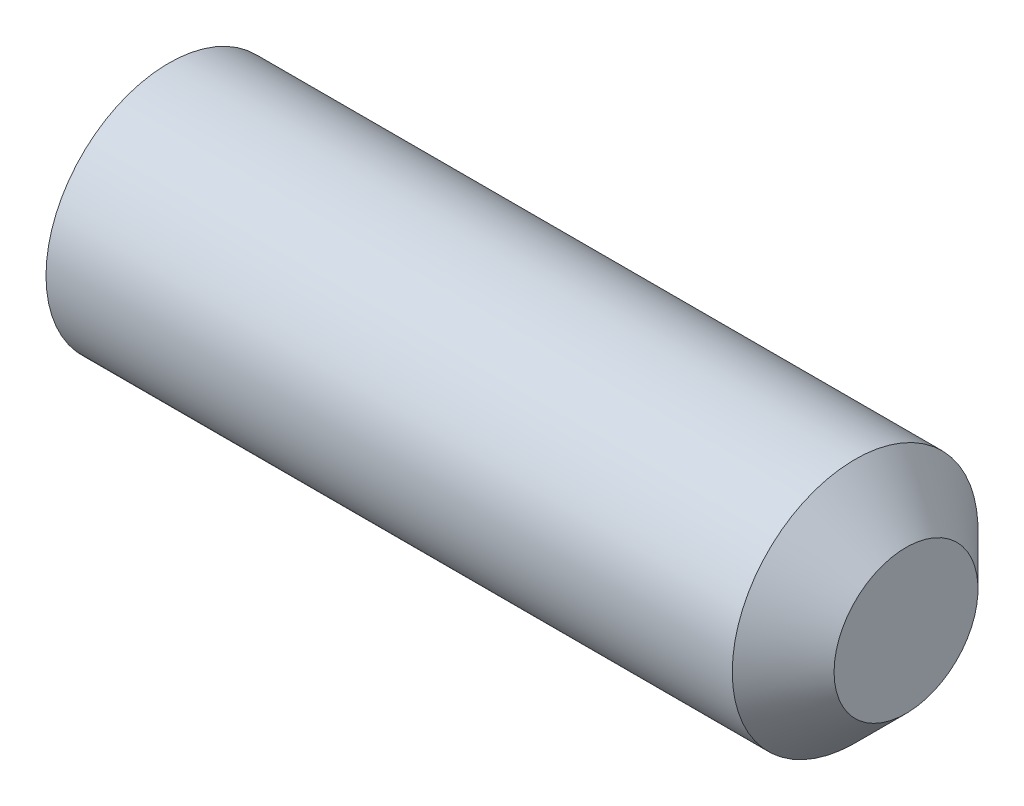
ISO-10303-21;
HEADER;
FILE_DESCRIPTION(('STEP AP214'),'2;1');
FILE_NAME('part.step','',(''),(''),'','','');
FILE_SCHEMA(('AUTOMOTIVE_DESIGN { 1 0 10303 214 1 1 1 1 }'));
ENDSEC;
DATA;
#1=APPLICATION_CONTEXT('core data for automotive mechanical design processes');
#2=APPLICATION_PROTOCOL_DEFINITION('international standard','automotive_design',2000,#1);
#3=PRODUCT_CONTEXT('',#1,'mechanical');
#4=PRODUCT('Part','Part','',(#3));
#5=PRODUCT_RELATED_PRODUCT_CATEGORY('part','',(#4));
#6=PRODUCT_DEFINITION_FORMATION('','',#4);
#7=PRODUCT_DEFINITION_CONTEXT('part definition',#1,'design');
#8=PRODUCT_DEFINITION('design','',#6,#7);
#9=PRODUCT_DEFINITION_SHAPE('','',#8);
#10=(LENGTH_UNIT() NAMED_UNIT(*) SI_UNIT(.MILLI.,.METRE.));
#11=(NAMED_UNIT(*) PLANE_ANGLE_UNIT() SI_UNIT($,.RADIAN.));
#12=(NAMED_UNIT(*) SI_UNIT($,.STERADIAN.) SOLID_ANGLE_UNIT());
#13=UNCERTAINTY_MEASURE_WITH_UNIT(LENGTH_MEASURE(1.E-05),#10,'distance_accuracy_value','');
#14=(GEOMETRIC_REPRESENTATION_CONTEXT(3) GLOBAL_UNCERTAINTY_ASSIGNED_CONTEXT((#13)) GLOBAL_UNIT_ASSIGNED_CONTEXT((#10,
#11,#12)) REPRESENTATION_CONTEXT('',''));
#15=CARTESIAN_POINT('',(0.,0.,0.));
#16=DIRECTION('',(0.,0.,1.));
#17=DIRECTION('',(1.,0.,0.));
#18=AXIS2_PLACEMENT_3D('',#15,#16,#17);
#19=CARTESIAN_POINT('',(0.,5.,0.));
#20=DIRECTION('',(1.,0.,0.));
#21=DIRECTION('',(0.,0.,-1.));
#22=AXIS2_PLACEMENT_3D('',#19,#20,#21);
#23=PLANE('',#22);
#24=DIRECTION('',(0.,-0.866025403784439,-0.5));
#25=VECTOR('',#24,1.);
#26=CARTESIAN_POINT('',(0.,2.5,-1.44337567297406));
#27=LINE('',#26,#25);
#28=CARTESIAN_POINT('',(0.,2.5,-1.44337567297406));
#29=VERTEX_POINT('',#28);
#30=CARTESIAN_POINT('',(0.,0.,-2.88675134594813));
#31=VERTEX_POINT('',#30);
#32=EDGE_CURVE('E122',#29,#31,#27,.T.);
#33=ORIENTED_EDGE('',*,*,#32,.F.);
#34=DIRECTION('',(0.,0.,-1.));
#35=VECTOR('',#34,1.);
#36=CARTESIAN_POINT('',(0.,2.5,1.44337567297407));
#37=LINE('',#36,#35);
#38=CARTESIAN_POINT('',(0.,2.5,1.44337567297407));
#39=VERTEX_POINT('',#38);
#40=EDGE_CURVE('E48',#39,#29,#37,.T.);
#41=ORIENTED_EDGE('',*,*,#40,.F.);
#42=DIRECTION('',(0.,0.866025403784439,-0.5));
#43=VECTOR('',#42,1.);
#44=CARTESIAN_POINT('',(0.,0.,2.88675134594813));
#45=LINE('',#44,#43);
#46=CARTESIAN_POINT('',(0.,0.,2.88675134594813));
#47=VERTEX_POINT('',#46);
#48=EDGE_CURVE('E131',#47,#39,#45,.T.);
#49=ORIENTED_EDGE('',*,*,#48,.F.);
#50=DIRECTION('',(0.,0.866025403784439,0.5));
#51=VECTOR('',#50,1.);
#52=CARTESIAN_POINT('',(0.,-2.5,1.44337567297406));
#53=LINE('',#52,#51);
#54=CARTESIAN_POINT('',(0.,-2.5,1.44337567297406));
#55=VERTEX_POINT('',#54);
#56=EDGE_CURVE('E129',#55,#47,#53,.T.);
#57=ORIENTED_EDGE('',*,*,#56,.F.);
#58=DIRECTION('',(0.,0.,1.));
#59=VECTOR('',#58,1.);
#60=CARTESIAN_POINT('',(0.,-2.5,-1.44337567297407));
#61=LINE('',#60,#59);
#62=CARTESIAN_POINT('',(0.,-2.5,-1.44337567297407));
#63=VERTEX_POINT('',#62);
#64=EDGE_CURVE('E96',#63,#55,#61,.T.);
#65=ORIENTED_EDGE('',*,*,#64,.F.);
#66=DIRECTION('',(0.,-0.866025403784439,0.5));
#67=VECTOR('',#66,1.);
#68=CARTESIAN_POINT('',(0.,0.,-2.88675134594813));
#69=LINE('',#68,#67);
#70=EDGE_CURVE('E125',#31,#63,#69,.T.);
#71=ORIENTED_EDGE('',*,*,#70,.F.);
#72=EDGE_LOOP('',(#33,#41,#49,#57,#65,#71));
#73=FACE_BOUND('',#72,.T.);
#74=CARTESIAN_POINT('',(0.,0.,0.));
#75=DIRECTION('',(-1.,0.,0.));
#76=DIRECTION('',(0.,0.,1.));
#77=AXIS2_PLACEMENT_3D('',#74,#75,#76);
#78=CIRCLE('',#77,5.);
#79=CARTESIAN_POINT('',(0.,0.,5.));
#80=VERTEX_POINT('',#79);
#81=EDGE_CURVE('E11',#80,#80,#78,.T.);
#82=ORIENTED_EDGE('',*,*,#81,.T.);
#83=EDGE_LOOP('',(#82));
#84=FACE_BOUND('',#83,.T.);
#85=ADVANCED_FACE('F34',(#73,#84),#23,.F.);
#86=CARTESIAN_POINT('',(0.,0.,0.));
#87=DIRECTION('',(-1.,0.,0.));
#88=DIRECTION('',(0.,0.,1.));
#89=AXIS2_PLACEMENT_3D('',#86,#87,#88);
#90=CYLINDRICAL_SURFACE('',#89,5.);
#91=ORIENTED_EDGE('',*,*,#81,.F.);
#92=EDGE_LOOP('',(#91));
#93=FACE_BOUND('',#92,.T.);
#94=CARTESIAN_POINT('',(27.9289321881345,0.,0.));
#95=DIRECTION('',(-1.,0.,0.));
#96=DIRECTION('',(0.,0.,1.));
#97=AXIS2_PLACEMENT_3D('',#94,#95,#96);
#98=CIRCLE('',#97,5.);
#99=CARTESIAN_POINT('',(27.9289321881345,0.,5.));
#100=VERTEX_POINT('',#99);
#101=EDGE_CURVE('E41',#100,#100,#98,.T.);
#102=ORIENTED_EDGE('',*,*,#101,.T.);
#103=EDGE_LOOP('',(#102));
#104=FACE_BOUND('',#103,.T.);
#105=ADVANCED_FACE('F145',(#93,#104),#90,.T.);
#106=CARTESIAN_POINT('',(30.,0.,0.));
#107=DIRECTION('',(-1.,0.,0.));
#108=DIRECTION('',(0.,0.,1.));
#109=AXIS2_PLACEMENT_3D('',#106,#107,#108);
#110=CONICAL_SURFACE('',#109,2.92893218813453,0.785398163397449);
#111=ORIENTED_EDGE('',*,*,#101,.F.);
#112=EDGE_LOOP('',(#111));
#113=FACE_BOUND('',#112,.T.);
#114=CARTESIAN_POINT('',(30.,0.,0.));
#115=DIRECTION('',(-1.,0.,0.));
#116=DIRECTION('',(0.,0.,1.));
#117=AXIS2_PLACEMENT_3D('',#114,#115,#116);
#118=CIRCLE('',#117,2.92893218813453);
#119=CARTESIAN_POINT('',(30.,0.,2.92893218813453));
#120=VERTEX_POINT('',#119);
#121=EDGE_CURVE('E135',#120,#120,#118,.T.);
#122=ORIENTED_EDGE('',*,*,#121,.T.);
#123=EDGE_LOOP('',(#122));
#124=FACE_BOUND('',#123,.T.);
#125=ADVANCED_FACE('F147',(#113,#124),#110,.T.);
#126=CARTESIAN_POINT('',(30.,2.92893218813453,0.));
#127=DIRECTION('',(-1.,0.,0.));
#128=DIRECTION('',(0.,0.,1.));
#129=AXIS2_PLACEMENT_3D('',#126,#127,#128);
#130=PLANE('',#129);
#131=ORIENTED_EDGE('',*,*,#121,.F.);
#132=EDGE_LOOP('',(#131));
#133=FACE_BOUND('',#132,.T.);
#134=ADVANCED_FACE('F150',(#133),#130,.F.);
#135=CARTESIAN_POINT('',(3.,2.5,1.44337567297407));
#136=DIRECTION('',(0.,1.,0.));
#137=DIRECTION('',(0.,0.,1.));
#138=AXIS2_PLACEMENT_3D('',#135,#136,#137);
#139=PLANE('',#138);
#140=ORIENTED_EDGE('',*,*,#40,.T.);
#141=DIRECTION('',(-1.,0.,0.));
#142=VECTOR('',#141,1.);
#143=CARTESIAN_POINT('',(3.,2.5,-1.44337567297406));
#144=LINE('',#143,#142);
#145=CARTESIAN_POINT('',(3.,2.5,-1.44337567297406));
#146=VERTEX_POINT('',#145);
#147=EDGE_CURVE('E78',#146,#29,#144,.T.);
#148=ORIENTED_EDGE('',*,*,#147,.F.);
#149=DIRECTION('',(0.,0.,-1.));
#150=VECTOR('',#149,1.);
#151=CARTESIAN_POINT('',(3.,2.5,1.44337567297407));
#152=LINE('',#151,#150);
#153=CARTESIAN_POINT('',(3.,2.5,1.44337567297407));
#154=VERTEX_POINT('',#153);
#155=EDGE_CURVE('E133',#154,#146,#152,.T.);
#156=ORIENTED_EDGE('',*,*,#155,.F.);
#157=DIRECTION('',(-1.,0.,0.));
#158=VECTOR('',#157,1.);
#159=CARTESIAN_POINT('',(3.,2.5,1.44337567297407));
#160=LINE('',#159,#158);
#161=EDGE_CURVE('E56',#154,#39,#160,.T.);
#162=ORIENTED_EDGE('',*,*,#161,.T.);
#163=EDGE_LOOP('',(#140,#148,#156,#162));
#164=FACE_BOUND('',#163,.T.);
#165=ADVANCED_FACE('F155',(#164),#139,.F.);
#166=CARTESIAN_POINT('',(3.,0.,2.88675134594813));
#167=DIRECTION('',(0.,0.5,0.866025403784439));
#168=DIRECTION('',(0.,-0.866025403784439,0.5));
#169=AXIS2_PLACEMENT_3D('',#166,#167,#168);
#170=PLANE('',#169);
#171=ORIENTED_EDGE('',*,*,#48,.T.);
#172=ORIENTED_EDGE('',*,*,#161,.F.);
#173=DIRECTION('',(0.,0.866025403784439,-0.5));
#174=VECTOR('',#173,1.);
#175=CARTESIAN_POINT('',(3.,0.,2.88675134594813));
#176=LINE('',#175,#174);
#177=CARTESIAN_POINT('',(3.,0.,2.88675134594813));
#178=VERTEX_POINT('',#177);
#179=EDGE_CURVE('E108',#178,#154,#176,.T.);
#180=ORIENTED_EDGE('',*,*,#179,.F.);
#181=DIRECTION('',(-1.,0.,0.));
#182=VECTOR('',#181,1.);
#183=CARTESIAN_POINT('',(3.,0.,2.88675134594813));
#184=LINE('',#183,#182);
#185=EDGE_CURVE('E100',#178,#47,#184,.T.);
#186=ORIENTED_EDGE('',*,*,#185,.T.);
#187=EDGE_LOOP('',(#171,#172,#180,#186));
#188=FACE_BOUND('',#187,.T.);
#189=ADVANCED_FACE('F160',(#188),#170,.F.);
#190=CARTESIAN_POINT('',(3.,-2.5,1.44337567297406));
#191=DIRECTION('',(0.,-0.5,0.866025403784438));
#192=DIRECTION('',(0.,-0.866025403784439,-0.5));
#193=AXIS2_PLACEMENT_3D('',#190,#191,#192);
#194=PLANE('',#193);
#195=ORIENTED_EDGE('',*,*,#56,.T.);
#196=ORIENTED_EDGE('',*,*,#185,.F.);
#197=DIRECTION('',(0.,0.866025403784439,0.5));
#198=VECTOR('',#197,1.);
#199=CARTESIAN_POINT('',(3.,-2.5,1.44337567297406));
#200=LINE('',#199,#198);
#201=CARTESIAN_POINT('',(3.,-2.5,1.44337567297406));
#202=VERTEX_POINT('',#201);
#203=EDGE_CURVE('E104',#202,#178,#200,.T.);
#204=ORIENTED_EDGE('',*,*,#203,.F.);
#205=DIRECTION('',(-1.,0.,0.));
#206=VECTOR('',#205,1.);
#207=CARTESIAN_POINT('',(3.,-2.5,1.44337567297406));
#208=LINE('',#207,#206);
#209=EDGE_CURVE('E89',#202,#55,#208,.T.);
#210=ORIENTED_EDGE('',*,*,#209,.T.);
#211=EDGE_LOOP('',(#195,#196,#204,#210));
#212=FACE_BOUND('',#211,.T.);
#213=ADVANCED_FACE('F105',(#212),#194,.F.);
#214=CARTESIAN_POINT('',(3.,-2.5,-1.44337567297407));
#215=DIRECTION('',(0.,-1.,0.));
#216=DIRECTION('',(0.,0.,-1.));
#217=AXIS2_PLACEMENT_3D('',#214,#215,#216);
#218=PLANE('',#217);
#219=ORIENTED_EDGE('',*,*,#64,.T.);
#220=ORIENTED_EDGE('',*,*,#209,.F.);
#221=DIRECTION('',(0.,0.,1.));
#222=VECTOR('',#221,1.);
#223=CARTESIAN_POINT('',(3.,-2.5,-1.44337567297407));
#224=LINE('',#223,#222);
#225=CARTESIAN_POINT('',(3.,-2.5,-1.44337567297407));
#226=VERTEX_POINT('',#225);
#227=EDGE_CURVE('E93',#226,#202,#224,.T.);
#228=ORIENTED_EDGE('',*,*,#227,.F.);
#229=DIRECTION('',(-1.,0.,0.));
#230=VECTOR('',#229,1.);
#231=CARTESIAN_POINT('',(3.,-2.5,-1.44337567297407));
#232=LINE('',#231,#230);
#233=EDGE_CURVE('E101',#226,#63,#232,.T.);
#234=ORIENTED_EDGE('',*,*,#233,.T.);
#235=EDGE_LOOP('',(#219,#220,#228,#234));
#236=FACE_BOUND('',#235,.T.);
#237=ADVANCED_FACE('F91',(#236),#218,.F.);
#238=CARTESIAN_POINT('',(3.,0.,-2.88675134594813));
#239=DIRECTION('',(0.,-0.5,-0.866025403784439));
#240=DIRECTION('',(0.,0.866025403784439,-0.5));
#241=AXIS2_PLACEMENT_3D('',#238,#239,#240);
#242=PLANE('',#241);
#243=ORIENTED_EDGE('',*,*,#70,.T.);
#244=ORIENTED_EDGE('',*,*,#233,.F.);
#245=DIRECTION('',(0.,-0.866025403784439,0.5));
#246=VECTOR('',#245,1.);
#247=CARTESIAN_POINT('',(3.,0.,-2.88675134594813));
#248=LINE('',#247,#246);
#249=CARTESIAN_POINT('',(3.,0.,-2.88675134594813));
#250=VERTEX_POINT('',#249);
#251=EDGE_CURVE('E114',#250,#226,#248,.T.);
#252=ORIENTED_EDGE('',*,*,#251,.F.);
#253=DIRECTION('',(-1.,0.,0.));
#254=VECTOR('',#253,1.);
#255=CARTESIAN_POINT('',(3.,0.,-2.88675134594813));
#256=LINE('',#255,#254);
#257=EDGE_CURVE('E138',#250,#31,#256,.T.);
#258=ORIENTED_EDGE('',*,*,#257,.T.);
#259=EDGE_LOOP('',(#243,#244,#252,#258));
#260=FACE_BOUND('',#259,.T.);
#261=ADVANCED_FACE('F186',(#260),#242,.F.);
#262=CARTESIAN_POINT('',(3.,2.5,-1.44337567297406));
#263=DIRECTION('',(0.,0.5,-0.866025403784438));
#264=DIRECTION('',(0.,0.866025403784439,0.5));
#265=AXIS2_PLACEMENT_3D('',#262,#263,#264);
#266=PLANE('',#265);
#267=ORIENTED_EDGE('',*,*,#32,.T.);
#268=ORIENTED_EDGE('',*,*,#257,.F.);
#269=DIRECTION('',(0.,-0.866025403784439,-0.5));
#270=VECTOR('',#269,1.);
#271=CARTESIAN_POINT('',(3.,2.5,-1.44337567297406));
#272=LINE('',#271,#270);
#273=EDGE_CURVE('E116',#146,#250,#272,.T.);
#274=ORIENTED_EDGE('',*,*,#273,.F.);
#275=ORIENTED_EDGE('',*,*,#147,.T.);
#276=EDGE_LOOP('',(#267,#268,#274,#275));
#277=FACE_BOUND('',#276,.T.);
#278=ADVANCED_FACE('F174',(#277),#266,.F.);
#279=CARTESIAN_POINT('',(3.,2.5,-4.33012701892219));
#280=DIRECTION('',(-1.,0.,0.));
#281=DIRECTION('',(0.,0.,1.));
#282=AXIS2_PLACEMENT_3D('',#279,#280,#281);
#283=PLANE('',#282);
#284=ORIENTED_EDGE('',*,*,#155,.T.);
#285=ORIENTED_EDGE('',*,*,#273,.T.);
#286=ORIENTED_EDGE('',*,*,#251,.T.);
#287=ORIENTED_EDGE('',*,*,#227,.T.);
#288=ORIENTED_EDGE('',*,*,#203,.T.);
#289=ORIENTED_EDGE('',*,*,#179,.T.);
#290=EDGE_LOOP('',(#284,#285,#286,#287,#288,#289));
#291=FACE_BOUND('',#290,.T.);
#292=ADVANCED_FACE('F111',(#291),#283,.T.);
#293=CLOSED_SHELL('',(#85,#105,#125,#134,#165,#189,#213,#237,#261,#278,#292));
#294=MANIFOLD_SOLID_BREP('B2',#293);
#295=ADVANCED_BREP_SHAPE_REPRESENTATION('',(#18,#294),#14);
#296=SHAPE_DEFINITION_REPRESENTATION(#9,#295);
ENDSEC;
END-ISO-10303-21;
